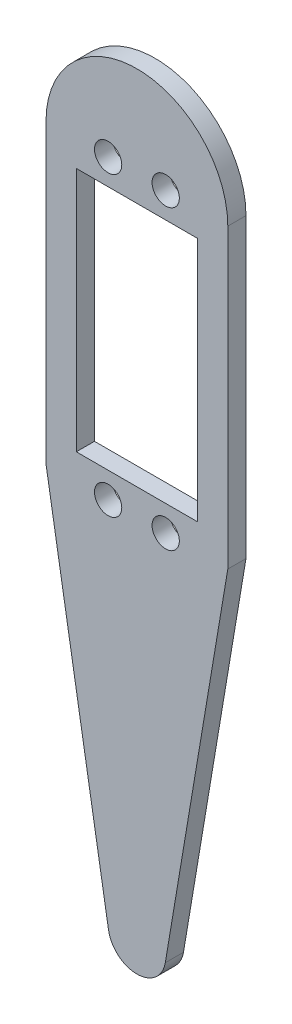
ISO-10303-21;
HEADER;
FILE_DESCRIPTION(('STEP AP214'),'2;1');
FILE_NAME('part.step','',(''),(''),'','','');
FILE_SCHEMA(('AUTOMOTIVE_DESIGN { 1 0 10303 214 1 1 1 1 }'));
ENDSEC;
DATA;
#1=APPLICATION_CONTEXT('core data for automotive mechanical design processes');
#2=APPLICATION_PROTOCOL_DEFINITION('international standard','automotive_design',2000,#1);
#3=PRODUCT_CONTEXT('',#1,'mechanical');
#4=PRODUCT('Part','Part','',(#3));
#5=PRODUCT_RELATED_PRODUCT_CATEGORY('part','',(#4));
#6=PRODUCT_DEFINITION_FORMATION('','',#4);
#7=PRODUCT_DEFINITION_CONTEXT('part definition',#1,'design');
#8=PRODUCT_DEFINITION('design','',#6,#7);
#9=PRODUCT_DEFINITION_SHAPE('','',#8);
#10=(LENGTH_UNIT() NAMED_UNIT(*) SI_UNIT(.MILLI.,.METRE.));
#11=(NAMED_UNIT(*) PLANE_ANGLE_UNIT() SI_UNIT($,.RADIAN.));
#12=(NAMED_UNIT(*) SI_UNIT($,.STERADIAN.) SOLID_ANGLE_UNIT());
#13=UNCERTAINTY_MEASURE_WITH_UNIT(LENGTH_MEASURE(1.E-05),#10,'distance_accuracy_value','');
#14=(GEOMETRIC_REPRESENTATION_CONTEXT(3) GLOBAL_UNCERTAINTY_ASSIGNED_CONTEXT((#13)) GLOBAL_UNIT_ASSIGNED_CONTEXT((#10,
#11,#12)) REPRESENTATION_CONTEXT('',''));
#15=CARTESIAN_POINT('',(0.,0.,0.));
#16=DIRECTION('',(0.,0.,1.));
#17=DIRECTION('',(1.,0.,0.));
#18=AXIS2_PLACEMENT_3D('',#15,#16,#17);
#19=CARTESIAN_POINT('',(9.99999999999545,44.7499999999967,3.));
#20=DIRECTION('',(0.,0.,1.));
#21=DIRECTION('',(1.,0.,0.));
#22=AXIS2_PLACEMENT_3D('',#19,#20,#21);
#23=PLANE('',#22);
#24=CARTESIAN_POINT('',(14.7499999999117,44.7499999999967,3.));
#25=DIRECTION('',(0.,0.,1.));
#26=DIRECTION('',(1.,0.,0.));
#27=AXIS2_PLACEMENT_3D('',#24,#25,#26);
#28=CIRCLE('',#27,2.25);
#29=CARTESIAN_POINT('',(16.9999999999117,44.7499999999967,3.));
#30=VERTEX_POINT('',#29);
#31=EDGE_CURVE('E277',#30,#30,#28,.T.);
#32=ORIENTED_EDGE('',*,*,#31,.F.);
#33=EDGE_LOOP('',(#32));
#34=FACE_BOUND('',#33,.T.);
#35=CARTESIAN_POINT('',(14.7499999999117,-4.25000000000659,3.));
#36=DIRECTION('',(0.,0.,1.));
#37=DIRECTION('',(1.,0.,0.));
#38=AXIS2_PLACEMENT_3D('',#35,#36,#37);
#39=CIRCLE('',#38,2.25);
#40=CARTESIAN_POINT('',(16.9999999999117,-4.25000000000659,3.));
#41=VERTEX_POINT('',#40);
#42=EDGE_CURVE('E142',#41,#41,#39,.T.);
#43=ORIENTED_EDGE('',*,*,#42,.F.);
#44=EDGE_LOOP('',(#43));
#45=FACE_BOUND('',#44,.T.);
#46=CARTESIAN_POINT('',(9.99999999999545,44.7499999999967,3.));
#47=DIRECTION('',(0.,0.,1.));
#48=DIRECTION('',(1.,0.,0.));
#49=AXIS2_PLACEMENT_3D('',#46,#47,#48);
#50=CIRCLE('',#49,14.9999999999159);
#51=CARTESIAN_POINT('',(24.999999999834,44.7499999999967,3.));
#52=VERTEX_POINT('',#51);
#53=CARTESIAN_POINT('',(-4.99999999999773,44.7499999999967,3.));
#54=VERTEX_POINT('',#53);
#55=EDGE_CURVE('E152',#52,#54,#50,.T.);
#56=ORIENTED_EDGE('',*,*,#55,.T.);
#57=DIRECTION('',(0.,-1.,0.));
#58=VECTOR('',#57,1.);
#59=CARTESIAN_POINT('',(-4.99999999999773,44.7499999999967,3.));
#60=LINE('',#59,#58);
#61=CARTESIAN_POINT('',(-4.99999999999773,-4.25000000000659,3.));
#62=VERTEX_POINT('',#61);
#63=EDGE_CURVE('E155',#54,#62,#60,.T.);
#64=ORIENTED_EDGE('',*,*,#63,.T.);
#65=DIRECTION('',(0.165614424752405,-0.986190581132232,0.));
#66=VECTOR('',#65,1.);
#67=CARTESIAN_POINT('',(-4.99999999999773,-4.25000000000659,3.));
#68=LINE('',#67,#66);
#69=CARTESIAN_POINT('',(5.31559473962546,-65.676668517574,3.));
#70=VERTEX_POINT('',#69);
#71=EDGE_CURVE('E158',#62,#70,#68,.T.);
#72=ORIENTED_EDGE('',*,*,#71,.T.);
#73=CARTESIAN_POINT('',(10.0000000000035,-64.89,3.));
#74=DIRECTION('',(0.,0.,1.));
#75=DIRECTION('',(1.,0.,0.));
#76=AXIS2_PLACEMENT_3D('',#73,#74,#75);
#77=CIRCLE('',#76,4.75000000000001);
#78=CARTESIAN_POINT('',(14.6844052603816,-65.6766685175741,3.));
#79=VERTEX_POINT('',#78);
#80=EDGE_CURVE('E160',#70,#79,#77,.T.);
#81=ORIENTED_EDGE('',*,*,#80,.T.);
#82=DIRECTION('',(0.165614424749728,0.986190581132682,0.));
#83=VECTOR('',#82,1.);
#84=CARTESIAN_POINT('',(24.9999999998328,-4.25000000000989,3.));
#85=LINE('',#84,#83);
#86=CARTESIAN_POINT('',(24.9999999998328,-4.25000000000989,3.));
#87=VERTEX_POINT('',#86);
#88=EDGE_CURVE('E162',#79,#87,#85,.T.);
#89=ORIENTED_EDGE('',*,*,#88,.T.);
#90=DIRECTION('',(0.,1.,0.));
#91=VECTOR('',#90,1.);
#92=CARTESIAN_POINT('',(24.999999999834,44.7499999999967,3.));
#93=LINE('',#92,#91);
#94=EDGE_CURVE('E164',#87,#52,#93,.T.);
#95=ORIENTED_EDGE('',*,*,#94,.T.);
#96=EDGE_LOOP('',(#56,#64,#72,#81,#89,#95));
#97=FACE_BOUND('',#96,.T.);
#98=DIRECTION('',(1.,0.,0.));
#99=VECTOR('',#98,1.);
#100=CARTESIAN_POINT('',(0.,0.,3.));
#101=LINE('',#100,#99);
#102=CARTESIAN_POINT('',(0.,0.,3.));
#103=VERTEX_POINT('',#102);
#104=CARTESIAN_POINT('',(20.,0.,3.));
#105=VERTEX_POINT('',#104);
#106=EDGE_CURVE('E121',#103,#105,#101,.T.);
#107=ORIENTED_EDGE('',*,*,#106,.F.);
#108=DIRECTION('',(0.,-1.,0.));
#109=VECTOR('',#108,1.);
#110=CARTESIAN_POINT('',(0.,0.,3.));
#111=LINE('',#110,#109);
#112=CARTESIAN_POINT('',(0.,40.5,3.));
#113=VERTEX_POINT('',#112);
#114=EDGE_CURVE('E113',#113,#103,#111,.T.);
#115=ORIENTED_EDGE('',*,*,#114,.F.);
#116=DIRECTION('',(-1.,0.,0.));
#117=VECTOR('',#116,1.);
#118=CARTESIAN_POINT('',(0.,40.5,3.));
#119=LINE('',#118,#117);
#120=CARTESIAN_POINT('',(20.,40.5,3.));
#121=VERTEX_POINT('',#120);
#122=EDGE_CURVE('E136',#121,#113,#119,.T.);
#123=ORIENTED_EDGE('',*,*,#122,.F.);
#124=DIRECTION('',(0.,1.,0.));
#125=VECTOR('',#124,1.);
#126=CARTESIAN_POINT('',(20.,0.,3.));
#127=LINE('',#126,#125);
#128=EDGE_CURVE('E134',#105,#121,#127,.T.);
#129=ORIENTED_EDGE('',*,*,#128,.F.);
#130=EDGE_LOOP('',(#107,#115,#123,#129));
#131=FACE_BOUND('',#130,.T.);
#132=CARTESIAN_POINT('',(5.24999999991035,-4.25000000000659,3.));
#133=DIRECTION('',(0.,0.,1.));
#134=DIRECTION('',(1.,0.,0.));
#135=AXIS2_PLACEMENT_3D('',#132,#133,#134);
#136=CIRCLE('',#135,2.25);
#137=CARTESIAN_POINT('',(7.49999999991035,-4.25000000000659,3.));
#138=VERTEX_POINT('',#137);
#139=EDGE_CURVE('E283',#138,#138,#136,.T.);
#140=ORIENTED_EDGE('',*,*,#139,.F.);
#141=EDGE_LOOP('',(#140));
#142=FACE_BOUND('',#141,.T.);
#143=CARTESIAN_POINT('',(5.24999999991035,44.7499999999967,3.));
#144=DIRECTION('',(0.,0.,1.));
#145=DIRECTION('',(1.,0.,0.));
#146=AXIS2_PLACEMENT_3D('',#143,#144,#145);
#147=CIRCLE('',#146,2.25);
#148=CARTESIAN_POINT('',(7.49999999991035,44.7499999999967,3.));
#149=VERTEX_POINT('',#148);
#150=EDGE_CURVE('E268',#149,#149,#147,.T.);
#151=ORIENTED_EDGE('',*,*,#150,.F.);
#152=EDGE_LOOP('',(#151));
#153=FACE_BOUND('',#152,.T.);
#154=ADVANCED_FACE('F36',(#34,#45,#97,#131,#142,#153),#23,.T.);
#155=CARTESIAN_POINT('',(9.99999999999545,44.7499999999967,0.));
#156=DIRECTION('',(0.,0.,1.));
#157=DIRECTION('',(1.,0.,0.));
#158=AXIS2_PLACEMENT_3D('',#155,#156,#157);
#159=PLANE('',#158);
#160=CARTESIAN_POINT('',(14.7499999999117,44.7499999999967,0.));
#161=DIRECTION('',(0.,0.,1.));
#162=DIRECTION('',(1.,0.,0.));
#163=AXIS2_PLACEMENT_3D('',#160,#161,#162);
#164=CIRCLE('',#163,2.25);
#165=CARTESIAN_POINT('',(16.9999999999117,44.7499999999967,0.));
#166=VERTEX_POINT('',#165);
#167=EDGE_CURVE('E274',#166,#166,#164,.T.);
#168=ORIENTED_EDGE('',*,*,#167,.T.);
#169=EDGE_LOOP('',(#168));
#170=FACE_BOUND('',#169,.T.);
#171=CARTESIAN_POINT('',(14.7499999999117,-4.25000000000659,0.));
#172=DIRECTION('',(0.,0.,1.));
#173=DIRECTION('',(1.,0.,0.));
#174=AXIS2_PLACEMENT_3D('',#171,#172,#173);
#175=CIRCLE('',#174,2.25);
#176=CARTESIAN_POINT('',(16.9999999999117,-4.25000000000659,0.));
#177=VERTEX_POINT('',#176);
#178=EDGE_CURVE('E286',#177,#177,#175,.T.);
#179=ORIENTED_EDGE('',*,*,#178,.T.);
#180=EDGE_LOOP('',(#179));
#181=FACE_BOUND('',#180,.T.);
#182=CARTESIAN_POINT('',(9.99999999999545,44.7499999999967,0.));
#183=DIRECTION('',(0.,0.,1.));
#184=DIRECTION('',(1.,0.,0.));
#185=AXIS2_PLACEMENT_3D('',#182,#183,#184);
#186=CIRCLE('',#185,14.9999999999159);
#187=CARTESIAN_POINT('',(24.999999999834,44.7499999999967,0.));
#188=VERTEX_POINT('',#187);
#189=CARTESIAN_POINT('',(-4.99999999999773,44.7499999999967,0.));
#190=VERTEX_POINT('',#189);
#191=EDGE_CURVE('E129',#188,#190,#186,.T.);
#192=ORIENTED_EDGE('',*,*,#191,.F.);
#193=DIRECTION('',(0.,1.,0.));
#194=VECTOR('',#193,1.);
#195=CARTESIAN_POINT('',(24.999999999834,44.7499999999967,0.));
#196=LINE('',#195,#194);
#197=CARTESIAN_POINT('',(24.9999999998328,-4.25000000000989,0.));
#198=VERTEX_POINT('',#197);
#199=EDGE_CURVE('E156',#198,#188,#196,.T.);
#200=ORIENTED_EDGE('',*,*,#199,.F.);
#201=DIRECTION('',(0.165614424749728,0.986190581132682,0.));
#202=VECTOR('',#201,1.);
#203=CARTESIAN_POINT('',(24.9999999998328,-4.25000000000989,0.));
#204=LINE('',#203,#202);
#205=CARTESIAN_POINT('',(14.6844052603816,-65.6766685175741,0.));
#206=VERTEX_POINT('',#205);
#207=EDGE_CURVE('E175',#206,#198,#204,.T.);
#208=ORIENTED_EDGE('',*,*,#207,.F.);
#209=CARTESIAN_POINT('',(10.0000000000035,-64.89,0.));
#210=DIRECTION('',(0.,0.,1.));
#211=DIRECTION('',(1.,0.,0.));
#212=AXIS2_PLACEMENT_3D('',#209,#210,#211);
#213=CIRCLE('',#212,4.75000000000001);
#214=CARTESIAN_POINT('',(5.31559473962546,-65.676668517574,0.));
#215=VERTEX_POINT('',#214);
#216=EDGE_CURVE('E173',#215,#206,#213,.T.);
#217=ORIENTED_EDGE('',*,*,#216,.F.);
#218=DIRECTION('',(0.165614424752405,-0.986190581132232,0.));
#219=VECTOR('',#218,1.);
#220=CARTESIAN_POINT('',(-4.99999999999773,-4.25000000000659,0.));
#221=LINE('',#220,#219);
#222=CARTESIAN_POINT('',(-4.99999999999773,-4.25000000000659,0.));
#223=VERTEX_POINT('',#222);
#224=EDGE_CURVE('E171',#223,#215,#221,.T.);
#225=ORIENTED_EDGE('',*,*,#224,.F.);
#226=DIRECTION('',(0.,-1.,0.));
#227=VECTOR('',#226,1.);
#228=CARTESIAN_POINT('',(-4.99999999999773,44.7499999999967,0.));
#229=LINE('',#228,#227);
#230=EDGE_CURVE('E169',#190,#223,#229,.T.);
#231=ORIENTED_EDGE('',*,*,#230,.F.);
#232=EDGE_LOOP('',(#192,#200,#208,#217,#225,#231));
#233=FACE_BOUND('',#232,.T.);
#234=DIRECTION('',(0.,-1.,0.));
#235=VECTOR('',#234,1.);
#236=CARTESIAN_POINT('',(0.,0.,0.));
#237=LINE('',#236,#235);
#238=CARTESIAN_POINT('',(0.,40.5,0.));
#239=VERTEX_POINT('',#238);
#240=CARTESIAN_POINT('',(0.,0.,0.));
#241=VERTEX_POINT('',#240);
#242=EDGE_CURVE('E59',#239,#241,#237,.T.);
#243=ORIENTED_EDGE('',*,*,#242,.T.);
#244=DIRECTION('',(1.,0.,0.));
#245=VECTOR('',#244,1.);
#246=CARTESIAN_POINT('',(0.,0.,0.));
#247=LINE('',#246,#245);
#248=CARTESIAN_POINT('',(20.,0.,0.));
#249=VERTEX_POINT('',#248);
#250=EDGE_CURVE('E128',#241,#249,#247,.T.);
#251=ORIENTED_EDGE('',*,*,#250,.T.);
#252=DIRECTION('',(0.,1.,0.));
#253=VECTOR('',#252,1.);
#254=CARTESIAN_POINT('',(20.,0.,0.));
#255=LINE('',#254,#253);
#256=CARTESIAN_POINT('',(20.,40.5,0.));
#257=VERTEX_POINT('',#256);
#258=EDGE_CURVE('E144',#249,#257,#255,.T.);
#259=ORIENTED_EDGE('',*,*,#258,.T.);
#260=DIRECTION('',(-1.,0.,0.));
#261=VECTOR('',#260,1.);
#262=CARTESIAN_POINT('',(0.,40.5,0.));
#263=LINE('',#262,#261);
#264=EDGE_CURVE('E122',#257,#239,#263,.T.);
#265=ORIENTED_EDGE('',*,*,#264,.T.);
#266=EDGE_LOOP('',(#243,#251,#259,#265));
#267=FACE_BOUND('',#266,.T.);
#268=CARTESIAN_POINT('',(5.24999999991035,-4.25000000000659,0.));
#269=DIRECTION('',(0.,0.,1.));
#270=DIRECTION('',(1.,0.,0.));
#271=AXIS2_PLACEMENT_3D('',#268,#269,#270);
#272=CIRCLE('',#271,2.25);
#273=CARTESIAN_POINT('',(7.49999999991035,-4.25000000000659,0.));
#274=VERTEX_POINT('',#273);
#275=EDGE_CURVE('E280',#274,#274,#272,.T.);
#276=ORIENTED_EDGE('',*,*,#275,.T.);
#277=EDGE_LOOP('',(#276));
#278=FACE_BOUND('',#277,.T.);
#279=CARTESIAN_POINT('',(5.24999999991035,44.7499999999967,0.));
#280=DIRECTION('',(0.,0.,1.));
#281=DIRECTION('',(1.,0.,0.));
#282=AXIS2_PLACEMENT_3D('',#279,#280,#281);
#283=CIRCLE('',#282,2.25);
#284=CARTESIAN_POINT('',(7.49999999991035,44.7499999999967,0.));
#285=VERTEX_POINT('',#284);
#286=EDGE_CURVE('E271',#285,#285,#283,.T.);
#287=ORIENTED_EDGE('',*,*,#286,.T.);
#288=EDGE_LOOP('',(#287));
#289=FACE_BOUND('',#288,.T.);
#290=ADVANCED_FACE('F199',(#170,#181,#233,#267,#278,#289),#159,.F.);
#291=CARTESIAN_POINT('',(9.99999999999545,44.7499999999967,3.));
#292=DIRECTION('',(0.,0.,-1.));
#293=DIRECTION('',(-1.,0.,0.));
#294=AXIS2_PLACEMENT_3D('',#291,#292,#293);
#295=CYLINDRICAL_SURFACE('',#294,14.9999999999159);
#296=ORIENTED_EDGE('',*,*,#191,.T.);
#297=DIRECTION('',(0.,0.,-1.));
#298=VECTOR('',#297,1.);
#299=CARTESIAN_POINT('',(-4.99999999999773,44.7499999999967,3.));
#300=LINE('',#299,#298);
#301=EDGE_CURVE('E11',#54,#190,#300,.T.);
#302=ORIENTED_EDGE('',*,*,#301,.F.);
#303=ORIENTED_EDGE('',*,*,#55,.F.);
#304=DIRECTION('',(0.,0.,-1.));
#305=VECTOR('',#304,1.);
#306=CARTESIAN_POINT('',(24.999999999834,44.7499999999967,3.));
#307=LINE('',#306,#305);
#308=EDGE_CURVE('E166',#52,#188,#307,.T.);
#309=ORIENTED_EDGE('',*,*,#308,.T.);
#310=EDGE_LOOP('',(#296,#302,#303,#309));
#311=FACE_BOUND('',#310,.T.);
#312=ADVANCED_FACE('F38',(#311),#295,.T.);
#313=CARTESIAN_POINT('',(-4.99999999999773,44.7499999999967,3.));
#314=DIRECTION('',(1.,0.,0.));
#315=DIRECTION('',(0.,0.,-1.));
#316=AXIS2_PLACEMENT_3D('',#313,#314,#315);
#317=PLANE('',#316);
#318=ORIENTED_EDGE('',*,*,#230,.T.);
#319=DIRECTION('',(0.,0.,-1.));
#320=VECTOR('',#319,1.);
#321=CARTESIAN_POINT('',(-4.99999999999773,-4.25000000000659,3.));
#322=LINE('',#321,#320);
#323=EDGE_CURVE('E44',#62,#223,#322,.T.);
#324=ORIENTED_EDGE('',*,*,#323,.F.);
#325=ORIENTED_EDGE('',*,*,#63,.F.);
#326=ORIENTED_EDGE('',*,*,#301,.T.);
#327=EDGE_LOOP('',(#318,#324,#325,#326));
#328=FACE_BOUND('',#327,.T.);
#329=ADVANCED_FACE('F216',(#328),#317,.F.);
#330=CARTESIAN_POINT('',(-4.99999999999773,-4.25000000000659,3.));
#331=DIRECTION('',(0.986190581132232,0.165614424752405,0.));
#332=DIRECTION('',(-0.165614424752405,0.986190581132232,0.));
#333=AXIS2_PLACEMENT_3D('',#330,#331,#332);
#334=PLANE('',#333);
#335=ORIENTED_EDGE('',*,*,#224,.T.);
#336=DIRECTION('',(0.,0.,-1.));
#337=VECTOR('',#336,1.);
#338=CARTESIAN_POINT('',(5.31559473962546,-65.676668517574,3.));
#339=LINE('',#338,#337);
#340=EDGE_CURVE('E186',#70,#215,#339,.T.);
#341=ORIENTED_EDGE('',*,*,#340,.F.);
#342=ORIENTED_EDGE('',*,*,#71,.F.);
#343=ORIENTED_EDGE('',*,*,#323,.T.);
#344=EDGE_LOOP('',(#335,#341,#342,#343));
#345=FACE_BOUND('',#344,.T.);
#346=ADVANCED_FACE('F193',(#345),#334,.F.);
#347=CARTESIAN_POINT('',(10.0000000000035,-64.89,3.));
#348=DIRECTION('',(0.,0.,-1.));
#349=DIRECTION('',(-1.,0.,0.));
#350=AXIS2_PLACEMENT_3D('',#347,#348,#349);
#351=CYLINDRICAL_SURFACE('',#350,4.75000000000001);
#352=ORIENTED_EDGE('',*,*,#216,.T.);
#353=DIRECTION('',(0.,0.,-1.));
#354=VECTOR('',#353,1.);
#355=CARTESIAN_POINT('',(14.6844052603816,-65.6766685175741,3.));
#356=LINE('',#355,#354);
#357=EDGE_CURVE('E183',#79,#206,#356,.T.);
#358=ORIENTED_EDGE('',*,*,#357,.F.);
#359=ORIENTED_EDGE('',*,*,#80,.F.);
#360=ORIENTED_EDGE('',*,*,#340,.T.);
#361=EDGE_LOOP('',(#352,#358,#359,#360));
#362=FACE_BOUND('',#361,.T.);
#363=ADVANCED_FACE('F205',(#362),#351,.T.);
#364=CARTESIAN_POINT('',(24.9999999998328,-4.25000000000989,3.));
#365=DIRECTION('',(-0.986190581132682,0.165614424749728,0.));
#366=DIRECTION('',(-0.165614424749728,-0.986190581132682,0.));
#367=AXIS2_PLACEMENT_3D('',#364,#365,#366);
#368=PLANE('',#367);
#369=ORIENTED_EDGE('',*,*,#207,.T.);
#370=DIRECTION('',(0.,0.,-1.));
#371=VECTOR('',#370,1.);
#372=CARTESIAN_POINT('',(24.9999999998328,-4.25000000000989,3.));
#373=LINE('',#372,#371);
#374=EDGE_CURVE('E180',#87,#198,#373,.T.);
#375=ORIENTED_EDGE('',*,*,#374,.F.);
#376=ORIENTED_EDGE('',*,*,#88,.F.);
#377=ORIENTED_EDGE('',*,*,#357,.T.);
#378=EDGE_LOOP('',(#369,#375,#376,#377));
#379=FACE_BOUND('',#378,.T.);
#380=ADVANCED_FACE('F209',(#379),#368,.F.);
#381=CARTESIAN_POINT('',(24.999999999834,44.7499999999967,3.));
#382=DIRECTION('',(-1.,0.,0.));
#383=DIRECTION('',(0.,-1.,0.));
#384=AXIS2_PLACEMENT_3D('',#381,#382,#383);
#385=PLANE('',#384);
#386=ORIENTED_EDGE('',*,*,#199,.T.);
#387=ORIENTED_EDGE('',*,*,#308,.F.);
#388=ORIENTED_EDGE('',*,*,#94,.F.);
#389=ORIENTED_EDGE('',*,*,#374,.T.);
#390=EDGE_LOOP('',(#386,#387,#388,#389));
#391=FACE_BOUND('',#390,.T.);
#392=ADVANCED_FACE('F219',(#391),#385,.F.);
#393=CARTESIAN_POINT('',(0.,0.,3.));
#394=DIRECTION('',(1.,0.,0.));
#395=DIRECTION('',(0.,0.,-1.));
#396=AXIS2_PLACEMENT_3D('',#393,#394,#395);
#397=PLANE('',#396);
#398=ORIENTED_EDGE('',*,*,#242,.F.);
#399=DIRECTION('',(0.,0.,-1.));
#400=VECTOR('',#399,1.);
#401=CARTESIAN_POINT('',(0.,40.5,3.));
#402=LINE('',#401,#400);
#403=EDGE_CURVE('E117',#113,#239,#402,.T.);
#404=ORIENTED_EDGE('',*,*,#403,.F.);
#405=ORIENTED_EDGE('',*,*,#114,.T.);
#406=DIRECTION('',(0.,0.,-1.));
#407=VECTOR('',#406,1.);
#408=CARTESIAN_POINT('',(0.,0.,3.));
#409=LINE('',#408,#407);
#410=EDGE_CURVE('E116',#103,#241,#409,.T.);
#411=ORIENTED_EDGE('',*,*,#410,.T.);
#412=EDGE_LOOP('',(#398,#404,#405,#411));
#413=FACE_BOUND('',#412,.T.);
#414=ADVANCED_FACE('F115',(#413),#397,.T.);
#415=CARTESIAN_POINT('',(0.,0.,3.));
#416=DIRECTION('',(0.,1.,0.));
#417=DIRECTION('',(0.,0.,1.));
#418=AXIS2_PLACEMENT_3D('',#415,#416,#417);
#419=PLANE('',#418);
#420=ORIENTED_EDGE('',*,*,#250,.F.);
#421=ORIENTED_EDGE('',*,*,#410,.F.);
#422=ORIENTED_EDGE('',*,*,#106,.T.);
#423=DIRECTION('',(0.,0.,-1.));
#424=VECTOR('',#423,1.);
#425=CARTESIAN_POINT('',(20.,0.,3.));
#426=LINE('',#425,#424);
#427=EDGE_CURVE('E130',#105,#249,#426,.T.);
#428=ORIENTED_EDGE('',*,*,#427,.T.);
#429=EDGE_LOOP('',(#420,#421,#422,#428));
#430=FACE_BOUND('',#429,.T.);
#431=ADVANCED_FACE('F125',(#430),#419,.T.);
#432=CARTESIAN_POINT('',(20.,0.,3.));
#433=DIRECTION('',(-1.,0.,0.));
#434=DIRECTION('',(0.,0.,1.));
#435=AXIS2_PLACEMENT_3D('',#432,#433,#434);
#436=PLANE('',#435);
#437=ORIENTED_EDGE('',*,*,#258,.F.);
#438=ORIENTED_EDGE('',*,*,#427,.F.);
#439=ORIENTED_EDGE('',*,*,#128,.T.);
#440=DIRECTION('',(0.,0.,-1.));
#441=VECTOR('',#440,1.);
#442=CARTESIAN_POINT('',(20.,40.5,3.));
#443=LINE('',#442,#441);
#444=EDGE_CURVE('E51',#121,#257,#443,.T.);
#445=ORIENTED_EDGE('',*,*,#444,.T.);
#446=EDGE_LOOP('',(#437,#438,#439,#445));
#447=FACE_BOUND('',#446,.T.);
#448=ADVANCED_FACE('F241',(#447),#436,.T.);
#449=CARTESIAN_POINT('',(0.,40.5,3.));
#450=DIRECTION('',(0.,-1.,0.));
#451=DIRECTION('',(0.,0.,-1.));
#452=AXIS2_PLACEMENT_3D('',#449,#450,#451);
#453=PLANE('',#452);
#454=ORIENTED_EDGE('',*,*,#264,.F.);
#455=ORIENTED_EDGE('',*,*,#444,.F.);
#456=ORIENTED_EDGE('',*,*,#122,.T.);
#457=ORIENTED_EDGE('',*,*,#403,.T.);
#458=EDGE_LOOP('',(#454,#455,#456,#457));
#459=FACE_BOUND('',#458,.T.);
#460=ADVANCED_FACE('F244',(#459),#453,.T.);
#461=CARTESIAN_POINT('',(14.7499999999117,-4.25000000000659,3.));
#462=DIRECTION('',(0.,0.,-1.));
#463=DIRECTION('',(-1.,0.,0.));
#464=AXIS2_PLACEMENT_3D('',#461,#462,#463);
#465=CYLINDRICAL_SURFACE('',#464,2.25);
#466=ORIENTED_EDGE('',*,*,#42,.T.);
#467=EDGE_LOOP('',(#466));
#468=FACE_BOUND('',#467,.T.);
#469=ORIENTED_EDGE('',*,*,#178,.F.);
#470=EDGE_LOOP('',(#469));
#471=FACE_BOUND('',#470,.T.);
#472=ADVANCED_FACE('F248',(#468,#471),#465,.F.);
#473=CARTESIAN_POINT('',(5.24999999991035,-4.25000000000659,3.));
#474=DIRECTION('',(0.,0.,-1.));
#475=DIRECTION('',(-1.,0.,0.));
#476=AXIS2_PLACEMENT_3D('',#473,#474,#475);
#477=CYLINDRICAL_SURFACE('',#476,2.25);
#478=ORIENTED_EDGE('',*,*,#139,.T.);
#479=EDGE_LOOP('',(#478));
#480=FACE_BOUND('',#479,.T.);
#481=ORIENTED_EDGE('',*,*,#275,.F.);
#482=EDGE_LOOP('',(#481));
#483=FACE_BOUND('',#482,.T.);
#484=ADVANCED_FACE('F251',(#480,#483),#477,.F.);
#485=CARTESIAN_POINT('',(14.7499999999117,44.7499999999967,3.));
#486=DIRECTION('',(0.,0.,-1.));
#487=DIRECTION('',(-1.,0.,0.));
#488=AXIS2_PLACEMENT_3D('',#485,#486,#487);
#489=CYLINDRICAL_SURFACE('',#488,2.25);
#490=ORIENTED_EDGE('',*,*,#31,.T.);
#491=EDGE_LOOP('',(#490));
#492=FACE_BOUND('',#491,.T.);
#493=ORIENTED_EDGE('',*,*,#167,.F.);
#494=EDGE_LOOP('',(#493));
#495=FACE_BOUND('',#494,.T.);
#496=ADVANCED_FACE('F255',(#492,#495),#489,.F.);
#497=CARTESIAN_POINT('',(5.24999999991035,44.7499999999967,3.));
#498=DIRECTION('',(0.,0.,-1.));
#499=DIRECTION('',(-1.,0.,0.));
#500=AXIS2_PLACEMENT_3D('',#497,#498,#499);
#501=CYLINDRICAL_SURFACE('',#500,2.25);
#502=ORIENTED_EDGE('',*,*,#150,.T.);
#503=EDGE_LOOP('',(#502));
#504=FACE_BOUND('',#503,.T.);
#505=ORIENTED_EDGE('',*,*,#286,.F.);
#506=EDGE_LOOP('',(#505));
#507=FACE_BOUND('',#506,.T.);
#508=ADVANCED_FACE('F259',(#504,#507),#501,.F.);
#509=CLOSED_SHELL('',(#154,#290,#312,#329,#346,#363,#380,#392,#414,#431,#448,#460,#472,#484,
#496,#508));
#510=MANIFOLD_SOLID_BREP('B2',#509);
#511=ADVANCED_BREP_SHAPE_REPRESENTATION('',(#18,#510),#14);
#512=SHAPE_DEFINITION_REPRESENTATION(#9,#511);
ENDSEC;
END-ISO-10303-21;
